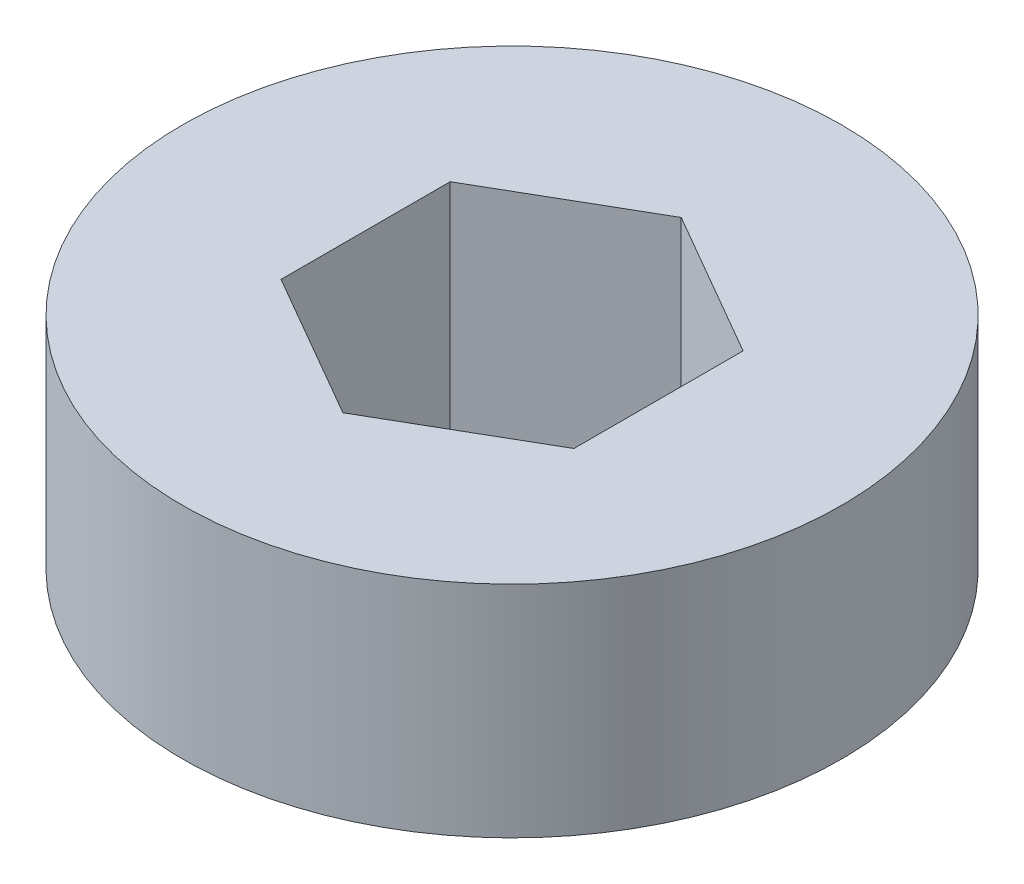
ISO-10303-21;
HEADER;
FILE_DESCRIPTION(('STEP AP214'),'2;1');
FILE_NAME('part.step','',(''),(''),'','','');
FILE_SCHEMA(('AUTOMOTIVE_DESIGN { 1 0 10303 214 1 1 1 1 }'));
ENDSEC;
DATA;
#1=APPLICATION_CONTEXT('core data for automotive mechanical design processes');
#2=APPLICATION_PROTOCOL_DEFINITION('international standard','automotive_design',2000,#1);
#3=PRODUCT_CONTEXT('',#1,'mechanical');
#4=PRODUCT('Part','Part','',(#3));
#5=PRODUCT_RELATED_PRODUCT_CATEGORY('part','',(#4));
#6=PRODUCT_DEFINITION_FORMATION('','',#4);
#7=PRODUCT_DEFINITION_CONTEXT('part definition',#1,'design');
#8=PRODUCT_DEFINITION('design','',#6,#7);
#9=PRODUCT_DEFINITION_SHAPE('','',#8);
#10=(LENGTH_UNIT() NAMED_UNIT(*) SI_UNIT(.MILLI.,.METRE.));
#11=(NAMED_UNIT(*) PLANE_ANGLE_UNIT() SI_UNIT($,.RADIAN.));
#12=(NAMED_UNIT(*) SI_UNIT($,.STERADIAN.) SOLID_ANGLE_UNIT());
#13=UNCERTAINTY_MEASURE_WITH_UNIT(LENGTH_MEASURE(1.E-05),#10,'distance_accuracy_value','');
#14=(GEOMETRIC_REPRESENTATION_CONTEXT(3) GLOBAL_UNCERTAINTY_ASSIGNED_CONTEXT((#13)) GLOBAL_UNIT_ASSIGNED_CONTEXT((#10,
#11,#12)) REPRESENTATION_CONTEXT('',''));
#15=CARTESIAN_POINT('',(0.,0.,0.));
#16=DIRECTION('',(0.,0.,1.));
#17=DIRECTION('',(1.,0.,0.));
#18=AXIS2_PLACEMENT_3D('',#15,#16,#17);
#19=CARTESIAN_POINT('',(0.,9.525,0.));
#20=DIRECTION('',(0.,1.,0.));
#21=DIRECTION('',(0.,0.,1.));
#22=AXIS2_PLACEMENT_3D('',#19,#20,#21);
#23=PLANE('',#22);
#24=CARTESIAN_POINT('',(0.,9.525,0.));
#25=DIRECTION('',(0.,1.,0.));
#26=DIRECTION('',(0.,0.,1.));
#27=AXIS2_PLACEMENT_3D('',#24,#25,#26);
#28=CIRCLE('',#27,14.2875);
#29=CARTESIAN_POINT('',(0.,9.525,-14.2875));
#30=VERTEX_POINT('',#29);
#31=EDGE_CURVE('E11',#30,#30,#28,.T.);
#32=ORIENTED_EDGE('',*,*,#31,.T.);
#33=EDGE_LOOP('',(#32));
#34=FACE_BOUND('',#33,.T.);
#35=DIRECTION('',(0.,0.,-1.));
#36=VECTOR('',#35,1.);
#37=CARTESIAN_POINT('',(6.35,9.525,3.66617420935412));
#38=LINE('',#37,#36);
#39=CARTESIAN_POINT('',(6.35,9.525,3.66617420935412));
#40=VERTEX_POINT('',#39);
#41=CARTESIAN_POINT('',(6.35,9.525,-3.66617420935413));
#42=VERTEX_POINT('',#41);
#43=EDGE_CURVE('E98',#40,#42,#38,.T.);
#44=ORIENTED_EDGE('',*,*,#43,.F.);
#45=DIRECTION('',(0.866025403784438,0.,-0.5));
#46=VECTOR('',#45,1.);
#47=CARTESIAN_POINT('',(0.,9.525,7.33234841870825));
#48=LINE('',#47,#46);
#49=CARTESIAN_POINT('',(0.,9.525,7.33234841870825));
#50=VERTEX_POINT('',#49);
#51=EDGE_CURVE('E90',#50,#40,#48,.T.);
#52=ORIENTED_EDGE('',*,*,#51,.F.);
#53=DIRECTION('',(0.866025403784438,0.,0.5));
#54=VECTOR('',#53,1.);
#55=CARTESIAN_POINT('',(-6.35,9.525,3.66617420935412));
#56=LINE('',#55,#54);
#57=CARTESIAN_POINT('',(-6.35,9.525,3.66617420935412));
#58=VERTEX_POINT('',#57);
#59=EDGE_CURVE('E118',#58,#50,#56,.T.);
#60=ORIENTED_EDGE('',*,*,#59,.F.);
#61=DIRECTION('',(0.,0.,1.));
#62=VECTOR('',#61,1.);
#63=CARTESIAN_POINT('',(-6.35,9.525,-3.66617420935412));
#64=LINE('',#63,#62);
#65=CARTESIAN_POINT('',(-6.35,9.525,-3.66617420935412));
#66=VERTEX_POINT('',#65);
#67=EDGE_CURVE('E116',#66,#58,#64,.T.);
#68=ORIENTED_EDGE('',*,*,#67,.F.);
#69=DIRECTION('',(-0.866025403784439,0.,0.5));
#70=VECTOR('',#69,1.);
#71=CARTESIAN_POINT('',(0.,9.525,-7.33234841870825));
#72=LINE('',#71,#70);
#73=CARTESIAN_POINT('',(0.,9.525,-7.33234841870825));
#74=VERTEX_POINT('',#73);
#75=EDGE_CURVE('E112',#74,#66,#72,.T.);
#76=ORIENTED_EDGE('',*,*,#75,.F.);
#77=DIRECTION('',(-0.866025403784439,0.,-0.5));
#78=VECTOR('',#77,1.);
#79=CARTESIAN_POINT('',(6.35,9.525,-3.66617420935413));
#80=LINE('',#79,#78);
#81=EDGE_CURVE('E110',#42,#74,#80,.T.);
#82=ORIENTED_EDGE('',*,*,#81,.F.);
#83=EDGE_LOOP('',(#44,#52,#60,#68,#76,#82));
#84=FACE_BOUND('',#83,.T.);
#85=ADVANCED_FACE('F37',(#34,#84),#23,.T.);
#86=CARTESIAN_POINT('',(0.,0.,0.));
#87=DIRECTION('',(0.,1.,0.));
#88=DIRECTION('',(0.,0.,1.));
#89=AXIS2_PLACEMENT_3D('',#86,#87,#88);
#90=PLANE('',#89);
#91=CARTESIAN_POINT('',(0.,0.,0.));
#92=DIRECTION('',(0.,1.,0.));
#93=DIRECTION('',(0.,0.,1.));
#94=AXIS2_PLACEMENT_3D('',#91,#92,#93);
#95=CIRCLE('',#94,14.2875);
#96=CARTESIAN_POINT('',(0.,0.,-14.2875));
#97=VERTEX_POINT('',#96);
#98=EDGE_CURVE('E41',#97,#97,#95,.T.);
#99=ORIENTED_EDGE('',*,*,#98,.F.);
#100=EDGE_LOOP('',(#99));
#101=FACE_BOUND('',#100,.T.);
#102=DIRECTION('',(0.866025403784438,0.,-0.5));
#103=VECTOR('',#102,1.);
#104=CARTESIAN_POINT('',(0.,0.,7.33234841870825));
#105=LINE('',#104,#103);
#106=CARTESIAN_POINT('',(0.,0.,7.33234841870825));
#107=VERTEX_POINT('',#106);
#108=CARTESIAN_POINT('',(6.35,0.,3.66617420935412));
#109=VERTEX_POINT('',#108);
#110=EDGE_CURVE('E60',#107,#109,#105,.T.);
#111=ORIENTED_EDGE('',*,*,#110,.T.);
#112=DIRECTION('',(0.,0.,-1.));
#113=VECTOR('',#112,1.);
#114=CARTESIAN_POINT('',(6.35,0.,3.66617420935412));
#115=LINE('',#114,#113);
#116=CARTESIAN_POINT('',(6.35,0.,-3.66617420935413));
#117=VERTEX_POINT('',#116);
#118=EDGE_CURVE('E105',#109,#117,#115,.T.);
#119=ORIENTED_EDGE('',*,*,#118,.T.);
#120=DIRECTION('',(-0.866025403784439,0.,-0.5));
#121=VECTOR('',#120,1.);
#122=CARTESIAN_POINT('',(6.35,0.,-3.66617420935413));
#123=LINE('',#122,#121);
#124=CARTESIAN_POINT('',(0.,0.,-7.33234841870825));
#125=VERTEX_POINT('',#124);
#126=EDGE_CURVE('E122',#117,#125,#123,.T.);
#127=ORIENTED_EDGE('',*,*,#126,.T.);
#128=DIRECTION('',(-0.866025403784439,0.,0.5));
#129=VECTOR('',#128,1.);
#130=CARTESIAN_POINT('',(0.,0.,-7.33234841870825));
#131=LINE('',#130,#129);
#132=CARTESIAN_POINT('',(-6.35,0.,-3.66617420935412));
#133=VERTEX_POINT('',#132);
#134=EDGE_CURVE('E125',#125,#133,#131,.T.);
#135=ORIENTED_EDGE('',*,*,#134,.T.);
#136=DIRECTION('',(0.,0.,1.));
#137=VECTOR('',#136,1.);
#138=CARTESIAN_POINT('',(-6.35,0.,-3.66617420935412));
#139=LINE('',#138,#137);
#140=CARTESIAN_POINT('',(-6.35,0.,3.66617420935412));
#141=VERTEX_POINT('',#140);
#142=EDGE_CURVE('E128',#133,#141,#139,.T.);
#143=ORIENTED_EDGE('',*,*,#142,.T.);
#144=DIRECTION('',(0.866025403784438,0.,0.5));
#145=VECTOR('',#144,1.);
#146=CARTESIAN_POINT('',(-6.35,0.,3.66617420935412));
#147=LINE('',#146,#145);
#148=EDGE_CURVE('E99',#141,#107,#147,.T.);
#149=ORIENTED_EDGE('',*,*,#148,.T.);
#150=EDGE_LOOP('',(#111,#119,#127,#135,#143,#149));
#151=FACE_BOUND('',#150,.T.);
#152=ADVANCED_FACE('F145',(#101,#151),#90,.F.);
#153=CARTESIAN_POINT('',(0.,9.525,0.));
#154=DIRECTION('',(0.,-1.,0.));
#155=DIRECTION('',(0.,0.,-1.));
#156=AXIS2_PLACEMENT_3D('',#153,#154,#155);
#157=CYLINDRICAL_SURFACE('',#156,14.2875);
#158=CARTESIAN_POINT('',(0.,9.525,-14.2875));
#159=CARTESIAN_POINT('',(0.,9.42578125,-14.2875));
#160=CARTESIAN_POINT('',(0.,9.3265625,-14.2875));
#161=CARTESIAN_POINT('',(0.,9.128125,-14.2875));
#162=CARTESIAN_POINT('',(0.,9.02890625,-14.2875));
#163=CARTESIAN_POINT('',(0.,8.83046875,-14.2875));
#164=CARTESIAN_POINT('',(0.,8.73125,-14.2875));
#165=CARTESIAN_POINT('',(0.,8.5328125,-14.2875));
#166=CARTESIAN_POINT('',(0.,8.43359375,-14.2875));
#167=CARTESIAN_POINT('',(0.,8.23515625,-14.2875));
#168=CARTESIAN_POINT('',(0.,8.1359375,-14.2875));
#169=CARTESIAN_POINT('',(0.,7.9375,-14.2875));
#170=CARTESIAN_POINT('',(0.,7.83828125,-14.2875));
#171=CARTESIAN_POINT('',(0.,7.63984375,-14.2875));
#172=CARTESIAN_POINT('',(0.,7.540625,-14.2875));
#173=CARTESIAN_POINT('',(0.,7.3421875,-14.2875));
#174=CARTESIAN_POINT('',(0.,7.24296875,-14.2875));
#175=CARTESIAN_POINT('',(0.,7.04453125,-14.2875));
#176=CARTESIAN_POINT('',(0.,6.9453125,-14.2875));
#177=CARTESIAN_POINT('',(0.,6.746875,-14.2875));
#178=CARTESIAN_POINT('',(0.,6.64765625,-14.2875));
#179=CARTESIAN_POINT('',(0.,6.44921875,-14.2875));
#180=CARTESIAN_POINT('',(0.,6.35,-14.2875));
#181=CARTESIAN_POINT('',(0.,6.1515625,-14.2875));
#182=CARTESIAN_POINT('',(0.,6.05234375,-14.2875));
#183=CARTESIAN_POINT('',(0.,5.85390625,-14.2875));
#184=CARTESIAN_POINT('',(0.,5.7546875,-14.2875));
#185=CARTESIAN_POINT('',(0.,5.55625,-14.2875));
#186=CARTESIAN_POINT('',(0.,5.45703125,-14.2875));
#187=CARTESIAN_POINT('',(0.,5.25859375,-14.2875));
#188=CARTESIAN_POINT('',(0.,5.159375,-14.2875));
#189=CARTESIAN_POINT('',(0.,4.9609375,-14.2875));
#190=CARTESIAN_POINT('',(0.,4.86171875,-14.2875));
#191=CARTESIAN_POINT('',(0.,4.66328125,-14.2875));
#192=CARTESIAN_POINT('',(0.,4.5640625,-14.2875));
#193=CARTESIAN_POINT('',(0.,4.365625,-14.2875));
#194=CARTESIAN_POINT('',(0.,4.26640625,-14.2875));
#195=CARTESIAN_POINT('',(0.,4.06796875,-14.2875));
#196=CARTESIAN_POINT('',(0.,3.96875,-14.2875));
#197=CARTESIAN_POINT('',(0.,3.7703125,-14.2875));
#198=CARTESIAN_POINT('',(0.,3.67109375,-14.2875));
#199=CARTESIAN_POINT('',(0.,3.47265625,-14.2875));
#200=CARTESIAN_POINT('',(0.,3.3734375,-14.2875));
#201=CARTESIAN_POINT('',(0.,3.175,-14.2875));
#202=CARTESIAN_POINT('',(0.,3.07578125,-14.2875));
#203=CARTESIAN_POINT('',(0.,2.87734375,-14.2875));
#204=CARTESIAN_POINT('',(0.,2.778125,-14.2875));
#205=CARTESIAN_POINT('',(0.,2.5796875,-14.2875));
#206=CARTESIAN_POINT('',(0.,2.48046875,-14.2875));
#207=CARTESIAN_POINT('',(0.,2.28203125,-14.2875));
#208=CARTESIAN_POINT('',(0.,2.1828125,-14.2875));
#209=CARTESIAN_POINT('',(0.,1.984375,-14.2875));
#210=CARTESIAN_POINT('',(0.,1.88515625,-14.2875));
#211=CARTESIAN_POINT('',(0.,1.68671875,-14.2875));
#212=CARTESIAN_POINT('',(0.,1.5875,-14.2875));
#213=CARTESIAN_POINT('',(0.,1.3890625,-14.2875));
#214=CARTESIAN_POINT('',(0.,1.28984375,-14.2875));
#215=CARTESIAN_POINT('',(0.,1.09140625,-14.2875));
#216=CARTESIAN_POINT('',(0.,0.992187500000001,-14.2875));
#217=CARTESIAN_POINT('',(0.,0.793750000000001,-14.2875));
#218=CARTESIAN_POINT('',(0.,0.69453125,-14.2875));
#219=CARTESIAN_POINT('',(0.,0.49609375,-14.2875));
#220=CARTESIAN_POINT('',(0.,0.396875,-14.2875));
#221=CARTESIAN_POINT('',(0.,0.1984375,-14.2875));
#222=CARTESIAN_POINT('',(0.,0.0992187500000001,-14.2875));
#223=CARTESIAN_POINT('',(0.,0.,-14.2875));
#224=B_SPLINE_CURVE_WITH_KNOTS('',3,(#158,#159,#160,#161,#162,#163,#164,#165,#166,#167,#168,
#169,#170,#171,#172,#173,#174,#175,#176,#177,#178,#179,#180,#181,#182,#183,#184,#185,#186,#187,
#188,#189,#190,#191,#192,#193,#194,#195,#196,#197,#198,#199,#200,#201,#202,#203,#204,#205,#206,
#207,#208,#209,#210,#211,#212,#213,#214,#215,#216,#217,#218,#219,#220,#221,#222,#223),
.UNSPECIFIED.,.F.,.F.,(4,2,2,2,2,2,2,2,2,2,2,2,2,2,2,2,2,2,2,2,2,2,2,2,2,2,2,2,2,2,2,2,4),(0.,
0.29765625,0.5953125,0.892968750000001,1.190625,1.48828125,1.7859375,2.08359375,2.38125,
2.67890625,2.9765625,3.27421875,3.571875,3.86953125,4.1671875,4.46484375,4.7625,5.06015625,
5.3578125,5.65546875,5.953125,6.25078125,6.5484375,6.84609375,7.14375,7.44140625,7.7390625,
8.03671875,8.334375,8.63203125,8.9296875,9.22734375,9.525),.UNSPECIFIED.);
#225=EDGE_CURVE('BSEAM39',#30,#97,#224,.T.);
#226=ORIENTED_EDGE('',*,*,#31,.F.);
#227=ORIENTED_EDGE('',*,*,#98,.T.);
#228=ORIENTED_EDGE('',*,*,#225,.T.);
#229=ORIENTED_EDGE('',*,*,#225,.F.);
#230=EDGE_LOOP('',(#226,#228,#227,#229));
#231=FACE_BOUND('',#230,.T.);
#232=ADVANCED_FACE('F39',(#231),#157,.T.);
#233=CARTESIAN_POINT('',(0.,9.525,7.33234841870825));
#234=DIRECTION('',(-0.5,0.,-0.866025403784438));
#235=DIRECTION('',(-0.866025403784438,0.,0.5));
#236=AXIS2_PLACEMENT_3D('',#233,#234,#235);
#237=PLANE('',#236);
#238=ORIENTED_EDGE('',*,*,#110,.F.);
#239=DIRECTION('',(0.,-1.,0.));
#240=VECTOR('',#239,1.);
#241=CARTESIAN_POINT('',(0.,9.525,7.33234841870825));
#242=LINE('',#241,#240);
#243=EDGE_CURVE('E94',#50,#107,#242,.T.);
#244=ORIENTED_EDGE('',*,*,#243,.F.);
#245=ORIENTED_EDGE('',*,*,#51,.T.);
#246=DIRECTION('',(0.,-1.,0.));
#247=VECTOR('',#246,1.);
#248=CARTESIAN_POINT('',(6.35,9.525,3.66617420935412));
#249=LINE('',#248,#247);
#250=EDGE_CURVE('E93',#40,#109,#249,.T.);
#251=ORIENTED_EDGE('',*,*,#250,.T.);
#252=EDGE_LOOP('',(#238,#244,#245,#251));
#253=FACE_BOUND('',#252,.T.);
#254=ADVANCED_FACE('F92',(#253),#237,.T.);
#255=CARTESIAN_POINT('',(6.35,9.525,3.66617420935412));
#256=DIRECTION('',(-1.,0.,0.));
#257=DIRECTION('',(0.,0.,1.));
#258=AXIS2_PLACEMENT_3D('',#255,#256,#257);
#259=PLANE('',#258);
#260=ORIENTED_EDGE('',*,*,#118,.F.);
#261=ORIENTED_EDGE('',*,*,#250,.F.);
#262=ORIENTED_EDGE('',*,*,#43,.T.);
#263=DIRECTION('',(0.,-1.,0.));
#264=VECTOR('',#263,1.);
#265=CARTESIAN_POINT('',(6.35,9.525,-3.66617420935413));
#266=LINE('',#265,#264);
#267=EDGE_CURVE('E106',#42,#117,#266,.T.);
#268=ORIENTED_EDGE('',*,*,#267,.T.);
#269=EDGE_LOOP('',(#260,#261,#262,#268));
#270=FACE_BOUND('',#269,.T.);
#271=ADVANCED_FACE('F102',(#270),#259,.T.);
#272=CARTESIAN_POINT('',(6.35,9.525,-3.66617420935413));
#273=DIRECTION('',(-0.5,0.,0.866025403784439));
#274=DIRECTION('',(0.866025403784439,0.,0.5));
#275=AXIS2_PLACEMENT_3D('',#272,#273,#274);
#276=PLANE('',#275);
#277=ORIENTED_EDGE('',*,*,#126,.F.);
#278=ORIENTED_EDGE('',*,*,#267,.F.);
#279=ORIENTED_EDGE('',*,*,#81,.T.);
#280=DIRECTION('',(0.,-1.,0.));
#281=VECTOR('',#280,1.);
#282=CARTESIAN_POINT('',(0.,9.525,-7.33234841870825));
#283=LINE('',#282,#281);
#284=EDGE_CURVE('E137',#74,#125,#283,.T.);
#285=ORIENTED_EDGE('',*,*,#284,.T.);
#286=EDGE_LOOP('',(#277,#278,#279,#285));
#287=FACE_BOUND('',#286,.T.);
#288=ADVANCED_FACE('F141',(#287),#276,.T.);
#289=CARTESIAN_POINT('',(0.,9.525,-7.33234841870825));
#290=DIRECTION('',(0.5,0.,0.866025403784439));
#291=DIRECTION('',(0.866025403784438,0.,-0.5));
#292=AXIS2_PLACEMENT_3D('',#289,#290,#291);
#293=PLANE('',#292);
#294=ORIENTED_EDGE('',*,*,#134,.F.);
#295=ORIENTED_EDGE('',*,*,#284,.F.);
#296=ORIENTED_EDGE('',*,*,#75,.T.);
#297=DIRECTION('',(0.,-1.,0.));
#298=VECTOR('',#297,1.);
#299=CARTESIAN_POINT('',(-6.35,9.525,-3.66617420935412));
#300=LINE('',#299,#298);
#301=EDGE_CURVE('E135',#66,#133,#300,.T.);
#302=ORIENTED_EDGE('',*,*,#301,.T.);
#303=EDGE_LOOP('',(#294,#295,#296,#302));
#304=FACE_BOUND('',#303,.T.);
#305=ADVANCED_FACE('F153',(#304),#293,.T.);
#306=CARTESIAN_POINT('',(-6.35,9.525,-3.66617420935412));
#307=DIRECTION('',(1.,0.,0.));
#308=DIRECTION('',(0.,0.,-1.));
#309=AXIS2_PLACEMENT_3D('',#306,#307,#308);
#310=PLANE('',#309);
#311=ORIENTED_EDGE('',*,*,#142,.F.);
#312=ORIENTED_EDGE('',*,*,#301,.F.);
#313=ORIENTED_EDGE('',*,*,#67,.T.);
#314=DIRECTION('',(0.,-1.,0.));
#315=VECTOR('',#314,1.);
#316=CARTESIAN_POINT('',(-6.35,9.525,3.66617420935412));
#317=LINE('',#316,#315);
#318=EDGE_CURVE('E52',#58,#141,#317,.T.);
#319=ORIENTED_EDGE('',*,*,#318,.T.);
#320=EDGE_LOOP('',(#311,#312,#313,#319));
#321=FACE_BOUND('',#320,.T.);
#322=ADVANCED_FACE('F151',(#321),#310,.T.);
#323=CARTESIAN_POINT('',(-6.35,9.525,3.66617420935412));
#324=DIRECTION('',(0.5,0.,-0.866025403784439));
#325=DIRECTION('',(-0.866025403784439,0.,-0.5));
#326=AXIS2_PLACEMENT_3D('',#323,#324,#325);
#327=PLANE('',#326);
#328=ORIENTED_EDGE('',*,*,#148,.F.);
#329=ORIENTED_EDGE('',*,*,#318,.F.);
#330=ORIENTED_EDGE('',*,*,#59,.T.);
#331=ORIENTED_EDGE('',*,*,#243,.T.);
#332=EDGE_LOOP('',(#328,#329,#330,#331));
#333=FACE_BOUND('',#332,.T.);
#334=ADVANCED_FACE('F147',(#333),#327,.T.);
#335=CLOSED_SHELL('',(#85,#152,#232,#254,#271,#288,#305,#322,#334));
#336=MANIFOLD_SOLID_BREP('B2',#335);
#337=ADVANCED_BREP_SHAPE_REPRESENTATION('',(#18,#336),#14);
#338=SHAPE_DEFINITION_REPRESENTATION(#9,#337);
ENDSEC;
END-ISO-10303-21;
